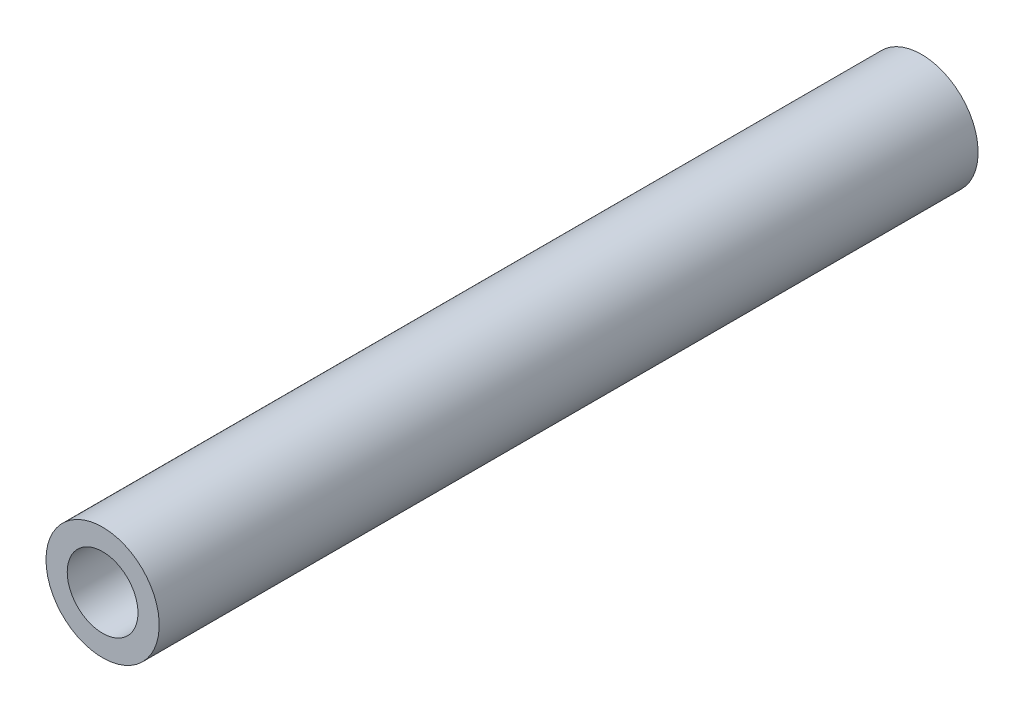
ISO-10303-21;
HEADER;
FILE_DESCRIPTION(('STEP AP214'),'2;1');
FILE_NAME('part.step','',(''),(''),'','','');
FILE_SCHEMA(('AUTOMOTIVE_DESIGN { 1 0 10303 214 1 1 1 1 }'));
ENDSEC;
DATA;
#1=APPLICATION_CONTEXT('core data for automotive mechanical design processes');
#2=APPLICATION_PROTOCOL_DEFINITION('international standard','automotive_design',2000,#1);
#3=PRODUCT_CONTEXT('',#1,'mechanical');
#4=PRODUCT('Part','Part','',(#3));
#5=PRODUCT_RELATED_PRODUCT_CATEGORY('part','',(#4));
#6=PRODUCT_DEFINITION_FORMATION('','',#4);
#7=PRODUCT_DEFINITION_CONTEXT('part definition',#1,'design');
#8=PRODUCT_DEFINITION('design','',#6,#7);
#9=PRODUCT_DEFINITION_SHAPE('','',#8);
#10=(LENGTH_UNIT() NAMED_UNIT(*) SI_UNIT(.MILLI.,.METRE.));
#11=(NAMED_UNIT(*) PLANE_ANGLE_UNIT() SI_UNIT($,.RADIAN.));
#12=(NAMED_UNIT(*) SI_UNIT($,.STERADIAN.) SOLID_ANGLE_UNIT());
#13=UNCERTAINTY_MEASURE_WITH_UNIT(LENGTH_MEASURE(1.E-05),#10,'distance_accuracy_value','');
#14=(GEOMETRIC_REPRESENTATION_CONTEXT(3) GLOBAL_UNCERTAINTY_ASSIGNED_CONTEXT((#13)) GLOBAL_UNIT_ASSIGNED_CONTEXT((#10,
#11,#12)) REPRESENTATION_CONTEXT('',''));
#15=CARTESIAN_POINT('',(0.,0.,0.));
#16=DIRECTION('',(0.,0.,1.));
#17=DIRECTION('',(1.,0.,0.));
#18=AXIS2_PLACEMENT_3D('',#15,#16,#17);
#19=CARTESIAN_POINT('',(0.,0.,57.87));
#20=DIRECTION('',(0.,0.,1.));
#21=DIRECTION('',(1.,0.,0.));
#22=AXIS2_PLACEMENT_3D('',#19,#20,#21);
#23=PLANE('',#22);
#24=CARTESIAN_POINT('',(0.,0.,57.87));
#25=DIRECTION('',(0.,0.,1.));
#26=DIRECTION('',(1.,0.,0.));
#27=AXIS2_PLACEMENT_3D('',#24,#25,#26);
#28=CIRCLE('',#27,4.);
#29=CARTESIAN_POINT('',(-4.,0.,57.87));
#30=VERTEX_POINT('',#29);
#31=EDGE_CURVE('E10',#30,#30,#28,.T.);
#32=ORIENTED_EDGE('',*,*,#31,.T.);
#33=EDGE_LOOP('',(#32));
#34=FACE_BOUND('',#33,.T.);
#35=CARTESIAN_POINT('',(0.,0.,57.87));
#36=DIRECTION('',(0.,0.,1.));
#37=DIRECTION('',(1.,0.,0.));
#38=AXIS2_PLACEMENT_3D('',#35,#36,#37);
#39=CIRCLE('',#38,2.5);
#40=CARTESIAN_POINT('',(-2.5,0.,57.87));
#41=VERTEX_POINT('',#40);
#42=EDGE_CURVE('E50',#41,#41,#39,.T.);
#43=ORIENTED_EDGE('',*,*,#42,.F.);
#44=EDGE_LOOP('',(#43));
#45=FACE_BOUND('',#44,.T.);
#46=ADVANCED_FACE('F39',(#34,#45),#23,.T.);
#47=CARTESIAN_POINT('',(0.,0.,0.));
#48=DIRECTION('',(0.,0.,1.));
#49=DIRECTION('',(1.,0.,0.));
#50=AXIS2_PLACEMENT_3D('',#47,#48,#49);
#51=PLANE('',#50);
#52=CARTESIAN_POINT('',(0.,0.,0.));
#53=DIRECTION('',(0.,0.,1.));
#54=DIRECTION('',(1.,0.,0.));
#55=AXIS2_PLACEMENT_3D('',#52,#53,#54);
#56=CIRCLE('',#55,4.);
#57=CARTESIAN_POINT('',(-4.,0.,0.));
#58=VERTEX_POINT('',#57);
#59=EDGE_CURVE('E43',#58,#58,#56,.T.);
#60=ORIENTED_EDGE('',*,*,#59,.F.);
#61=EDGE_LOOP('',(#60));
#62=FACE_BOUND('',#61,.T.);
#63=CARTESIAN_POINT('',(0.,0.,0.));
#64=DIRECTION('',(0.,0.,1.));
#65=DIRECTION('',(1.,0.,0.));
#66=AXIS2_PLACEMENT_3D('',#63,#64,#65);
#67=CIRCLE('',#66,2.5);
#68=CARTESIAN_POINT('',(-2.5,0.,0.));
#69=VERTEX_POINT('',#68);
#70=EDGE_CURVE('E52',#69,#69,#67,.T.);
#71=ORIENTED_EDGE('',*,*,#70,.T.);
#72=EDGE_LOOP('',(#71));
#73=FACE_BOUND('',#72,.T.);
#74=ADVANCED_FACE('F62',(#62,#73),#51,.F.);
#75=CARTESIAN_POINT('',(0.,0.,57.87));
#76=DIRECTION('',(0.,0.,-1.));
#77=DIRECTION('',(-1.,0.,0.));
#78=AXIS2_PLACEMENT_3D('',#75,#76,#77);
#79=CYLINDRICAL_SURFACE('',#78,4.);
#80=CARTESIAN_POINT('',(-4.,0.,57.87));
#81=CARTESIAN_POINT('',(-4.,0.,57.2671875));
#82=CARTESIAN_POINT('',(-4.,0.,56.664375));
#83=CARTESIAN_POINT('',(-4.,0.,55.45875));
#84=CARTESIAN_POINT('',(-4.,0.,54.8559375));
#85=CARTESIAN_POINT('',(-4.,0.,53.6503125));
#86=CARTESIAN_POINT('',(-4.,0.,53.0475));
#87=CARTESIAN_POINT('',(-4.,0.,51.841875));
#88=CARTESIAN_POINT('',(-4.,0.,51.2390625));
#89=CARTESIAN_POINT('',(-4.,0.,50.0334375));
#90=CARTESIAN_POINT('',(-4.,0.,49.430625));
#91=CARTESIAN_POINT('',(-4.,0.,48.225));
#92=CARTESIAN_POINT('',(-4.,0.,47.6221875));
#93=CARTESIAN_POINT('',(-4.,0.,46.4165625));
#94=CARTESIAN_POINT('',(-4.,0.,45.81375));
#95=CARTESIAN_POINT('',(-4.,0.,44.608125));
#96=CARTESIAN_POINT('',(-4.,0.,44.0053125));
#97=CARTESIAN_POINT('',(-4.,0.,42.7996875));
#98=CARTESIAN_POINT('',(-4.,0.,42.196875));
#99=CARTESIAN_POINT('',(-4.,0.,40.99125));
#100=CARTESIAN_POINT('',(-4.,0.,40.3884375));
#101=CARTESIAN_POINT('',(-4.,0.,39.1828125));
#102=CARTESIAN_POINT('',(-4.,0.,38.58));
#103=CARTESIAN_POINT('',(-4.,0.,37.374375));
#104=CARTESIAN_POINT('',(-4.,0.,36.7715625));
#105=CARTESIAN_POINT('',(-4.,0.,35.5659375));
#106=CARTESIAN_POINT('',(-4.,0.,34.963125));
#107=CARTESIAN_POINT('',(-4.,0.,33.7575));
#108=CARTESIAN_POINT('',(-4.,0.,33.1546875));
#109=CARTESIAN_POINT('',(-4.,0.,31.9490625));
#110=CARTESIAN_POINT('',(-4.,0.,31.34625));
#111=CARTESIAN_POINT('',(-4.,0.,30.140625));
#112=CARTESIAN_POINT('',(-4.,0.,29.5378125));
#113=CARTESIAN_POINT('',(-4.,0.,28.3321875));
#114=CARTESIAN_POINT('',(-4.,0.,27.729375));
#115=CARTESIAN_POINT('',(-4.,0.,26.52375));
#116=CARTESIAN_POINT('',(-4.,0.,25.9209375));
#117=CARTESIAN_POINT('',(-4.,0.,24.7153125));
#118=CARTESIAN_POINT('',(-4.,0.,24.1125));
#119=CARTESIAN_POINT('',(-4.,0.,22.906875));
#120=CARTESIAN_POINT('',(-4.,0.,22.3040625));
#121=CARTESIAN_POINT('',(-4.,0.,21.0984375));
#122=CARTESIAN_POINT('',(-4.,0.,20.495625));
#123=CARTESIAN_POINT('',(-4.,0.,19.29));
#124=CARTESIAN_POINT('',(-4.,0.,18.6871875));
#125=CARTESIAN_POINT('',(-4.,0.,17.4815625));
#126=CARTESIAN_POINT('',(-4.,0.,16.87875));
#127=CARTESIAN_POINT('',(-4.,0.,15.673125));
#128=CARTESIAN_POINT('',(-4.,0.,15.0703125));
#129=CARTESIAN_POINT('',(-4.,0.,13.8646875));
#130=CARTESIAN_POINT('',(-4.,0.,13.261875));
#131=CARTESIAN_POINT('',(-4.,0.,12.05625));
#132=CARTESIAN_POINT('',(-4.,0.,11.4534375));
#133=CARTESIAN_POINT('',(-4.,0.,10.2478125));
#134=CARTESIAN_POINT('',(-4.,0.,9.645));
#135=CARTESIAN_POINT('',(-4.,0.,8.439375));
#136=CARTESIAN_POINT('',(-4.,0.,7.8365625));
#137=CARTESIAN_POINT('',(-4.,0.,6.6309375));
#138=CARTESIAN_POINT('',(-4.,0.,6.028125));
#139=CARTESIAN_POINT('',(-4.,0.,4.8225));
#140=CARTESIAN_POINT('',(-4.,0.,4.2196875));
#141=CARTESIAN_POINT('',(-4.,0.,3.0140625));
#142=CARTESIAN_POINT('',(-4.,0.,2.41125));
#143=CARTESIAN_POINT('',(-4.,0.,1.205625));
#144=CARTESIAN_POINT('',(-4.,0.,0.6028125));
#145=CARTESIAN_POINT('',(-4.,0.,0.));
#146=B_SPLINE_CURVE_WITH_KNOTS('',3,(#80,#81,#82,#83,#84,#85,#86,#87,#88,#89,#90,#91,#92,#93,
#94,#95,#96,#97,#98,#99,#100,#101,#102,#103,#104,#105,#106,#107,#108,#109,#110,#111,#112,#113,
#114,#115,#116,#117,#118,#119,#120,#121,#122,#123,#124,#125,#126,#127,#128,#129,#130,#131,#132,
#133,#134,#135,#136,#137,#138,#139,#140,#141,#142,#143,#144,#145),.UNSPECIFIED.,.F.,.F.,(4,2,2,
2,2,2,2,2,2,2,2,2,2,2,2,2,2,2,2,2,2,2,2,2,2,2,2,2,2,2,2,2,4),(0.,1.8084375,3.61687500000001,
5.4253125,7.23375,9.0421875,10.850625,12.6590625,14.4675,16.2759375,18.084375,19.8928125,
21.70125,23.5096875,25.318125,27.1265625,28.935,30.7434375,32.551875,34.3603125,36.16875,
37.9771875,39.785625,41.5940625,43.4025,45.2109375,47.019375,48.8278125,50.63625,52.4446875,
54.253125,56.0615625,57.87),.UNSPECIFIED.);
#147=EDGE_CURVE('BSEAM41',#30,#58,#146,.T.);
#148=ORIENTED_EDGE('',*,*,#31,.F.);
#149=ORIENTED_EDGE('',*,*,#59,.T.);
#150=ORIENTED_EDGE('',*,*,#147,.T.);
#151=ORIENTED_EDGE('',*,*,#147,.F.);
#152=EDGE_LOOP('',(#148,#150,#149,#151));
#153=FACE_BOUND('',#152,.T.);
#154=ADVANCED_FACE('F41',(#153),#79,.T.);
#155=CARTESIAN_POINT('',(0.,0.,57.87));
#156=DIRECTION('',(0.,0.,-1.));
#157=DIRECTION('',(-1.,0.,0.));
#158=AXIS2_PLACEMENT_3D('',#155,#156,#157);
#159=CYLINDRICAL_SURFACE('',#158,2.5);
#160=CARTESIAN_POINT('',(-2.5,0.,57.87));
#161=CARTESIAN_POINT('',(-2.5,0.,57.2671875));
#162=CARTESIAN_POINT('',(-2.5,0.,56.664375));
#163=CARTESIAN_POINT('',(-2.5,0.,55.45875));
#164=CARTESIAN_POINT('',(-2.5,0.,54.8559375));
#165=CARTESIAN_POINT('',(-2.5,0.,53.6503125));
#166=CARTESIAN_POINT('',(-2.5,0.,53.0475));
#167=CARTESIAN_POINT('',(-2.5,0.,51.841875));
#168=CARTESIAN_POINT('',(-2.5,0.,51.2390625));
#169=CARTESIAN_POINT('',(-2.5,0.,50.0334375));
#170=CARTESIAN_POINT('',(-2.5,0.,49.430625));
#171=CARTESIAN_POINT('',(-2.5,0.,48.225));
#172=CARTESIAN_POINT('',(-2.5,0.,47.6221875));
#173=CARTESIAN_POINT('',(-2.5,0.,46.4165625));
#174=CARTESIAN_POINT('',(-2.5,0.,45.81375));
#175=CARTESIAN_POINT('',(-2.5,0.,44.608125));
#176=CARTESIAN_POINT('',(-2.5,0.,44.0053125));
#177=CARTESIAN_POINT('',(-2.5,0.,42.7996875));
#178=CARTESIAN_POINT('',(-2.5,0.,42.196875));
#179=CARTESIAN_POINT('',(-2.5,0.,40.99125));
#180=CARTESIAN_POINT('',(-2.5,0.,40.3884375));
#181=CARTESIAN_POINT('',(-2.5,0.,39.1828125));
#182=CARTESIAN_POINT('',(-2.5,0.,38.58));
#183=CARTESIAN_POINT('',(-2.5,0.,37.374375));
#184=CARTESIAN_POINT('',(-2.5,0.,36.7715625));
#185=CARTESIAN_POINT('',(-2.5,0.,35.5659375));
#186=CARTESIAN_POINT('',(-2.5,0.,34.963125));
#187=CARTESIAN_POINT('',(-2.5,0.,33.7575));
#188=CARTESIAN_POINT('',(-2.5,0.,33.1546875));
#189=CARTESIAN_POINT('',(-2.5,0.,31.9490625));
#190=CARTESIAN_POINT('',(-2.5,0.,31.34625));
#191=CARTESIAN_POINT('',(-2.5,0.,30.140625));
#192=CARTESIAN_POINT('',(-2.5,0.,29.5378125));
#193=CARTESIAN_POINT('',(-2.5,0.,28.3321875));
#194=CARTESIAN_POINT('',(-2.5,0.,27.729375));
#195=CARTESIAN_POINT('',(-2.5,0.,26.52375));
#196=CARTESIAN_POINT('',(-2.5,0.,25.9209375));
#197=CARTESIAN_POINT('',(-2.5,0.,24.7153125));
#198=CARTESIAN_POINT('',(-2.5,0.,24.1125));
#199=CARTESIAN_POINT('',(-2.5,0.,22.906875));
#200=CARTESIAN_POINT('',(-2.5,0.,22.3040625));
#201=CARTESIAN_POINT('',(-2.5,0.,21.0984375));
#202=CARTESIAN_POINT('',(-2.5,0.,20.495625));
#203=CARTESIAN_POINT('',(-2.5,0.,19.29));
#204=CARTESIAN_POINT('',(-2.5,0.,18.6871875));
#205=CARTESIAN_POINT('',(-2.5,0.,17.4815625));
#206=CARTESIAN_POINT('',(-2.5,0.,16.87875));
#207=CARTESIAN_POINT('',(-2.5,0.,15.673125));
#208=CARTESIAN_POINT('',(-2.5,0.,15.0703125));
#209=CARTESIAN_POINT('',(-2.5,0.,13.8646875));
#210=CARTESIAN_POINT('',(-2.5,0.,13.261875));
#211=CARTESIAN_POINT('',(-2.5,0.,12.05625));
#212=CARTESIAN_POINT('',(-2.5,0.,11.4534375));
#213=CARTESIAN_POINT('',(-2.5,0.,10.2478125));
#214=CARTESIAN_POINT('',(-2.5,0.,9.645));
#215=CARTESIAN_POINT('',(-2.5,0.,8.439375));
#216=CARTESIAN_POINT('',(-2.5,0.,7.8365625));
#217=CARTESIAN_POINT('',(-2.5,0.,6.6309375));
#218=CARTESIAN_POINT('',(-2.5,0.,6.028125));
#219=CARTESIAN_POINT('',(-2.5,0.,4.8225));
#220=CARTESIAN_POINT('',(-2.5,0.,4.2196875));
#221=CARTESIAN_POINT('',(-2.5,0.,3.0140625));
#222=CARTESIAN_POINT('',(-2.5,0.,2.41125));
#223=CARTESIAN_POINT('',(-2.5,0.,1.205625));
#224=CARTESIAN_POINT('',(-2.5,0.,0.6028125));
#225=CARTESIAN_POINT('',(-2.5,0.,0.));
#226=B_SPLINE_CURVE_WITH_KNOTS('',3,(#160,#161,#162,#163,#164,#165,#166,#167,#168,#169,#170,
#171,#172,#173,#174,#175,#176,#177,#178,#179,#180,#181,#182,#183,#184,#185,#186,#187,#188,#189,
#190,#191,#192,#193,#194,#195,#196,#197,#198,#199,#200,#201,#202,#203,#204,#205,#206,#207,#208,
#209,#210,#211,#212,#213,#214,#215,#216,#217,#218,#219,#220,#221,#222,#223,#224,#225),
.UNSPECIFIED.,.F.,.F.,(4,2,2,2,2,2,2,2,2,2,2,2,2,2,2,2,2,2,2,2,2,2,2,2,2,2,2,2,2,2,2,2,4),(0.,
1.8084375,3.61687500000001,5.4253125,7.23375,9.0421875,10.850625,12.6590625,14.4675,16.2759375,
18.084375,19.8928125,21.70125,23.5096875,25.318125,27.1265625,28.935,30.7434375,32.551875,
34.3603125,36.16875,37.9771875,39.785625,41.5940625,43.4025,45.2109375,47.019375,48.8278125,
50.63625,52.4446875,54.253125,56.0615625,57.87),.UNSPECIFIED.);
#227=EDGE_CURVE('BSEAM58',#41,#69,#226,.T.);
#228=ORIENTED_EDGE('',*,*,#42,.T.);
#229=ORIENTED_EDGE('',*,*,#70,.F.);
#230=ORIENTED_EDGE('',*,*,#227,.T.);
#231=ORIENTED_EDGE('',*,*,#227,.F.);
#232=EDGE_LOOP('',(#228,#230,#229,#231));
#233=FACE_BOUND('',#232,.T.);
#234=ADVANCED_FACE('F58',(#233),#159,.F.);
#235=CLOSED_SHELL('',(#46,#74,#154,#234));
#236=MANIFOLD_SOLID_BREP('B2',#235);
#237=ADVANCED_BREP_SHAPE_REPRESENTATION('',(#18,#236),#14);
#238=SHAPE_DEFINITION_REPRESENTATION(#9,#237);
ENDSEC;
END-ISO-10303-21;
